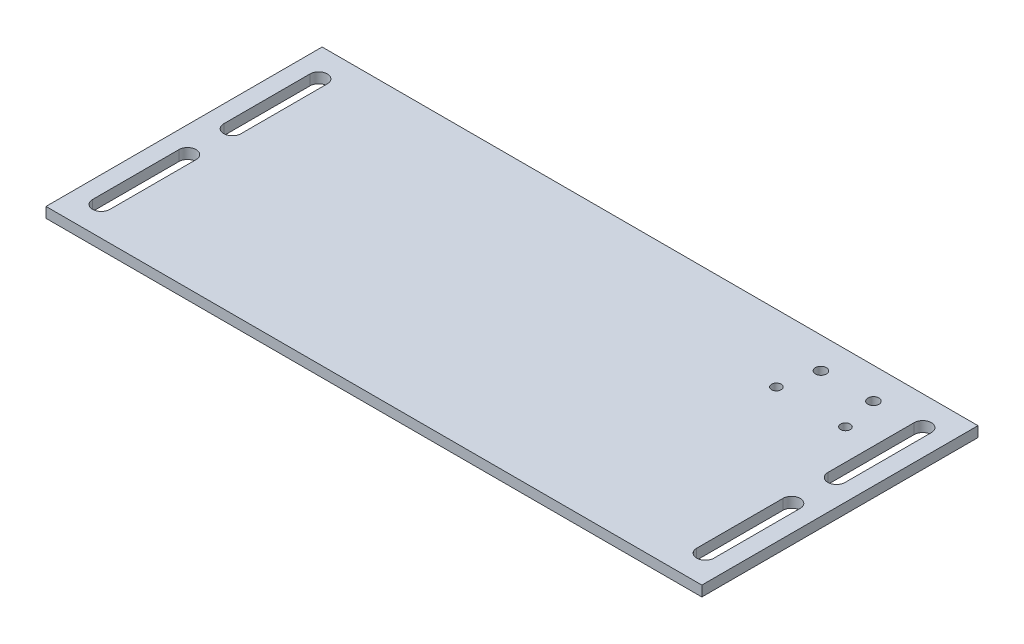
ISO-10303-21;
HEADER;
FILE_DESCRIPTION(('STEP AP214'),'2;1');
FILE_NAME('part.step','',(''),(''),'','','');
FILE_SCHEMA(('AUTOMOTIVE_DESIGN { 1 0 10303 214 1 1 1 1 }'));
ENDSEC;
DATA;
#1=APPLICATION_CONTEXT('core data for automotive mechanical design processes');
#2=APPLICATION_PROTOCOL_DEFINITION('international standard','automotive_design',2000,#1);
#3=PRODUCT_CONTEXT('',#1,'mechanical');
#4=PRODUCT('Part','Part','',(#3));
#5=PRODUCT_RELATED_PRODUCT_CATEGORY('part','',(#4));
#6=PRODUCT_DEFINITION_FORMATION('','',#4);
#7=PRODUCT_DEFINITION_CONTEXT('part definition',#1,'design');
#8=PRODUCT_DEFINITION('design','',#6,#7);
#9=PRODUCT_DEFINITION_SHAPE('','',#8);
#10=(LENGTH_UNIT() NAMED_UNIT(*) SI_UNIT(.MILLI.,.METRE.));
#11=(NAMED_UNIT(*) PLANE_ANGLE_UNIT() SI_UNIT($,.RADIAN.));
#12=(NAMED_UNIT(*) SI_UNIT($,.STERADIAN.) SOLID_ANGLE_UNIT());
#13=UNCERTAINTY_MEASURE_WITH_UNIT(LENGTH_MEASURE(1.E-05),#10,'distance_accuracy_value','');
#14=(GEOMETRIC_REPRESENTATION_CONTEXT(3) GLOBAL_UNCERTAINTY_ASSIGNED_CONTEXT((#13)) GLOBAL_UNIT_ASSIGNED_CONTEXT((#10,
#11,#12)) REPRESENTATION_CONTEXT('',''));
#15=CARTESIAN_POINT('',(0.,0.,0.));
#16=DIRECTION('',(0.,0.,1.));
#17=DIRECTION('',(1.,0.,0.));
#18=AXIS2_PLACEMENT_3D('',#15,#16,#17);
#19=CARTESIAN_POINT('',(0.,3.,0.));
#20=DIRECTION('',(0.,1.,0.));
#21=DIRECTION('',(0.,0.,1.));
#22=AXIS2_PLACEMENT_3D('',#19,#20,#21);
#23=PLANE('',#22);
#24=CARTESIAN_POINT('',(76.1,3.,-20.5));
#25=DIRECTION('',(0.,1.,0.));
#26=DIRECTION('',(0.,0.,1.));
#27=AXIS2_PLACEMENT_3D('',#24,#25,#26);
#28=CIRCLE('',#27,1.4);
#29=CARTESIAN_POINT('',(76.1,3.,-19.1));
#30=VERTEX_POINT('',#29);
#31=EDGE_CURVE('E581',#30,#30,#28,.T.);
#32=ORIENTED_EDGE('',*,*,#31,.F.);
#33=EDGE_LOOP('',(#32));
#34=FACE_BOUND('',#33,.T.);
#35=CARTESIAN_POINT('',(58.495,3.,-31.));
#36=DIRECTION('',(0.,1.,0.));
#37=DIRECTION('',(0.,0.,1.));
#38=AXIS2_PLACEMENT_3D('',#35,#36,#37);
#39=CIRCLE('',#38,1.6);
#40=CARTESIAN_POINT('',(58.495,3.,-29.4));
#41=VERTEX_POINT('',#40);
#42=EDGE_CURVE('E587',#41,#41,#39,.T.);
#43=ORIENTED_EDGE('',*,*,#42,.F.);
#44=EDGE_LOOP('',(#43));
#45=FACE_BOUND('',#44,.T.);
#46=CARTESIAN_POINT('',(73.705,3.,-31.));
#47=DIRECTION('',(0.,1.,0.));
#48=DIRECTION('',(0.,0.,1.));
#49=AXIS2_PLACEMENT_3D('',#46,#47,#48);
#50=CIRCLE('',#49,1.60000000000001);
#51=CARTESIAN_POINT('',(73.705,3.,-29.4));
#52=VERTEX_POINT('',#51);
#53=EDGE_CURVE('E604',#52,#52,#50,.T.);
#54=ORIENTED_EDGE('',*,*,#53,.F.);
#55=EDGE_LOOP('',(#54));
#56=FACE_BOUND('',#55,.T.);
#57=CARTESIAN_POINT('',(56.1,3.,-20.5));
#58=DIRECTION('',(0.,1.,0.));
#59=DIRECTION('',(0.,0.,1.));
#60=AXIS2_PLACEMENT_3D('',#57,#58,#59);
#61=CIRCLE('',#60,1.4);
#62=CARTESIAN_POINT('',(56.1,3.,-19.1));
#63=VERTEX_POINT('',#62);
#64=EDGE_CURVE('E584',#63,#63,#61,.T.);
#65=ORIENTED_EDGE('',*,*,#64,.F.);
#66=EDGE_LOOP('',(#65));
#67=FACE_BOUND('',#66,.T.);
#68=DIRECTION('',(0.,0.,1.));
#69=VECTOR('',#68,1.);
#70=CARTESIAN_POINT('',(-95.,3.,-40.));
#71=LINE('',#70,#69);
#72=CARTESIAN_POINT('',(-95.,3.,-40.));
#73=VERTEX_POINT('',#72);
#74=CARTESIAN_POINT('',(-95.,3.,40.));
#75=VERTEX_POINT('',#74);
#76=EDGE_CURVE('E304',#73,#75,#71,.T.);
#77=ORIENTED_EDGE('',*,*,#76,.T.);
#78=DIRECTION('',(1.,0.,0.));
#79=VECTOR('',#78,1.);
#80=CARTESIAN_POINT('',(-95.,3.,40.));
#81=LINE('',#80,#79);
#82=CARTESIAN_POINT('',(95.,3.,40.));
#83=VERTEX_POINT('',#82);
#84=EDGE_CURVE('E307',#75,#83,#81,.T.);
#85=ORIENTED_EDGE('',*,*,#84,.T.);
#86=DIRECTION('',(0.,0.,-1.));
#87=VECTOR('',#86,1.);
#88=CARTESIAN_POINT('',(95.,3.,-40.));
#89=LINE('',#88,#87);
#90=CARTESIAN_POINT('',(95.,3.,-40.));
#91=VERTEX_POINT('',#90);
#92=EDGE_CURVE('E310',#83,#91,#89,.T.);
#93=ORIENTED_EDGE('',*,*,#92,.T.);
#94=DIRECTION('',(-1.,0.,0.));
#95=VECTOR('',#94,1.);
#96=CARTESIAN_POINT('',(-95.,3.,-40.));
#97=LINE('',#96,#95);
#98=EDGE_CURVE('E312',#91,#73,#97,.T.);
#99=ORIENTED_EDGE('',*,*,#98,.T.);
#100=EDGE_LOOP('',(#77,#85,#93,#99));
#101=FACE_BOUND('',#100,.T.);
#102=DIRECTION('',(0.,0.,-1.));
#103=VECTOR('',#102,1.);
#104=CARTESIAN_POINT('',(-85.,3.,-6.5));
#105=LINE('',#104,#103);
#106=CARTESIAN_POINT('',(-85.,3.,-6.5));
#107=VERTEX_POINT('',#106);
#108=CARTESIAN_POINT('',(-85.,3.,-31.5));
#109=VERTEX_POINT('',#108);
#110=EDGE_CURVE('E275',#107,#109,#105,.T.);
#111=ORIENTED_EDGE('',*,*,#110,.F.);
#112=CARTESIAN_POINT('',(-87.5,3.,-6.5));
#113=DIRECTION('',(0.,1.,0.));
#114=DIRECTION('',(0.,0.,1.));
#115=AXIS2_PLACEMENT_3D('',#112,#113,#114);
#116=CIRCLE('',#115,2.5);
#117=CARTESIAN_POINT('',(-90.,3.,-6.5));
#118=VERTEX_POINT('',#117);
#119=EDGE_CURVE('E273',#118,#107,#116,.T.);
#120=ORIENTED_EDGE('',*,*,#119,.F.);
#121=DIRECTION('',(0.,0.,1.));
#122=VECTOR('',#121,1.);
#123=CARTESIAN_POINT('',(-90.,3.,-6.5));
#124=LINE('',#123,#122);
#125=CARTESIAN_POINT('',(-90.,3.,-31.5));
#126=VERTEX_POINT('',#125);
#127=EDGE_CURVE('E281',#126,#118,#124,.T.);
#128=ORIENTED_EDGE('',*,*,#127,.F.);
#129=CARTESIAN_POINT('',(-87.5,3.,-31.5));
#130=DIRECTION('',(0.,1.,0.));
#131=DIRECTION('',(0.,0.,1.));
#132=AXIS2_PLACEMENT_3D('',#129,#130,#131);
#133=CIRCLE('',#132,2.5);
#134=EDGE_CURVE('E278',#109,#126,#133,.T.);
#135=ORIENTED_EDGE('',*,*,#134,.F.);
#136=EDGE_LOOP('',(#111,#120,#128,#135));
#137=FACE_BOUND('',#136,.T.);
#138=DIRECTION('',(0.,0.,1.));
#139=VECTOR('',#138,1.);
#140=CARTESIAN_POINT('',(-90.,3.,6.49999999999996));
#141=LINE('',#140,#139);
#142=CARTESIAN_POINT('',(-90.,3.,6.49999999999996));
#143=VERTEX_POINT('',#142);
#144=CARTESIAN_POINT('',(-90.,3.,31.5));
#145=VERTEX_POINT('',#144);
#146=EDGE_CURVE('E244',#143,#145,#141,.T.);
#147=ORIENTED_EDGE('',*,*,#146,.F.);
#148=CARTESIAN_POINT('',(-87.5,3.,6.5));
#149=DIRECTION('',(0.,1.,0.));
#150=DIRECTION('',(0.,0.,-1.));
#151=AXIS2_PLACEMENT_3D('',#148,#149,#150);
#152=CIRCLE('',#151,2.5);
#153=CARTESIAN_POINT('',(-85.,3.,6.49999999999996));
#154=VERTEX_POINT('',#153);
#155=EDGE_CURVE('E242',#154,#143,#152,.T.);
#156=ORIENTED_EDGE('',*,*,#155,.F.);
#157=DIRECTION('',(0.,0.,-1.));
#158=VECTOR('',#157,1.);
#159=CARTESIAN_POINT('',(-85.,3.,6.49999999999996));
#160=LINE('',#159,#158);
#161=CARTESIAN_POINT('',(-85.,3.,31.5));
#162=VERTEX_POINT('',#161);
#163=EDGE_CURVE('E250',#162,#154,#160,.T.);
#164=ORIENTED_EDGE('',*,*,#163,.F.);
#165=CARTESIAN_POINT('',(-87.5,3.,31.5));
#166=DIRECTION('',(0.,1.,0.));
#167=DIRECTION('',(0.,0.,-1.));
#168=AXIS2_PLACEMENT_3D('',#165,#166,#167);
#169=CIRCLE('',#168,2.5);
#170=EDGE_CURVE('E247',#145,#162,#169,.T.);
#171=ORIENTED_EDGE('',*,*,#170,.F.);
#172=EDGE_LOOP('',(#147,#156,#164,#171));
#173=FACE_BOUND('',#172,.T.);
#174=DIRECTION('',(0.,0.,-1.));
#175=VECTOR('',#174,1.);
#176=CARTESIAN_POINT('',(90.,3.,-6.5));
#177=LINE('',#176,#175);
#178=CARTESIAN_POINT('',(90.,3.,-6.5));
#179=VERTEX_POINT('',#178);
#180=CARTESIAN_POINT('',(90.,3.,-31.5));
#181=VERTEX_POINT('',#180);
#182=EDGE_CURVE('E213',#179,#181,#177,.T.);
#183=ORIENTED_EDGE('',*,*,#182,.F.);
#184=CARTESIAN_POINT('',(87.5,3.,-6.5));
#185=DIRECTION('',(0.,1.,0.));
#186=DIRECTION('',(0.,0.,-1.));
#187=AXIS2_PLACEMENT_3D('',#184,#185,#186);
#188=CIRCLE('',#187,2.5);
#189=CARTESIAN_POINT('',(85.,3.,-6.5));
#190=VERTEX_POINT('',#189);
#191=EDGE_CURVE('E211',#190,#179,#188,.T.);
#192=ORIENTED_EDGE('',*,*,#191,.F.);
#193=DIRECTION('',(0.,0.,1.));
#194=VECTOR('',#193,1.);
#195=CARTESIAN_POINT('',(85.,3.,-6.5));
#196=LINE('',#195,#194);
#197=CARTESIAN_POINT('',(85.,3.,-31.5));
#198=VERTEX_POINT('',#197);
#199=EDGE_CURVE('E219',#198,#190,#196,.T.);
#200=ORIENTED_EDGE('',*,*,#199,.F.);
#201=CARTESIAN_POINT('',(87.5,3.,-31.5));
#202=DIRECTION('',(0.,1.,0.));
#203=DIRECTION('',(0.,0.,-1.));
#204=AXIS2_PLACEMENT_3D('',#201,#202,#203);
#205=CIRCLE('',#204,2.5);
#206=EDGE_CURVE('E216',#181,#198,#205,.T.);
#207=ORIENTED_EDGE('',*,*,#206,.F.);
#208=EDGE_LOOP('',(#183,#192,#200,#207));
#209=FACE_BOUND('',#208,.T.);
#210=DIRECTION('',(0.,0.,1.));
#211=VECTOR('',#210,1.);
#212=CARTESIAN_POINT('',(85.,3.,6.49999999999996));
#213=LINE('',#212,#211);
#214=CARTESIAN_POINT('',(85.,3.,6.49999999999996));
#215=VERTEX_POINT('',#214);
#216=CARTESIAN_POINT('',(85.,3.,31.5));
#217=VERTEX_POINT('',#216);
#218=EDGE_CURVE('E181',#215,#217,#213,.T.);
#219=ORIENTED_EDGE('',*,*,#218,.F.);
#220=CARTESIAN_POINT('',(87.5,3.,6.49999999999996));
#221=DIRECTION('',(0.,1.,0.));
#222=DIRECTION('',(0.,0.,1.));
#223=AXIS2_PLACEMENT_3D('',#220,#221,#222);
#224=CIRCLE('',#223,2.5);
#225=CARTESIAN_POINT('',(90.,3.,6.49999999999996));
#226=VERTEX_POINT('',#225);
#227=EDGE_CURVE('E173',#226,#215,#224,.T.);
#228=ORIENTED_EDGE('',*,*,#227,.F.);
#229=DIRECTION('',(0.,0.,-1.));
#230=VECTOR('',#229,1.);
#231=CARTESIAN_POINT('',(90.,3.,6.49999999999996));
#232=LINE('',#231,#230);
#233=CARTESIAN_POINT('',(90.,3.,31.5));
#234=VERTEX_POINT('',#233);
#235=EDGE_CURVE('E195',#234,#226,#232,.T.);
#236=ORIENTED_EDGE('',*,*,#235,.F.);
#237=CARTESIAN_POINT('',(87.5,3.,31.5));
#238=DIRECTION('',(0.,1.,0.));
#239=DIRECTION('',(0.,0.,1.));
#240=AXIS2_PLACEMENT_3D('',#237,#238,#239);
#241=CIRCLE('',#240,2.5);
#242=EDGE_CURVE('E193',#217,#234,#241,.T.);
#243=ORIENTED_EDGE('',*,*,#242,.F.);
#244=EDGE_LOOP('',(#219,#228,#236,#243));
#245=FACE_BOUND('',#244,.T.);
#246=ADVANCED_FACE('F36',(#34,#45,#56,#67,#101,#137,#173,#209,#245),#23,.T.);
#247=CARTESIAN_POINT('',(0.,0.,0.));
#248=DIRECTION('',(0.,1.,0.));
#249=DIRECTION('',(0.,0.,1.));
#250=AXIS2_PLACEMENT_3D('',#247,#248,#249);
#251=PLANE('',#250);
#252=CARTESIAN_POINT('',(76.1,0.,-20.5));
#253=DIRECTION('',(0.,1.,0.));
#254=DIRECTION('',(0.,0.,1.));
#255=AXIS2_PLACEMENT_3D('',#252,#253,#254);
#256=CIRCLE('',#255,1.4);
#257=CARTESIAN_POINT('',(76.1,0.,-19.1));
#258=VERTEX_POINT('',#257);
#259=EDGE_CURVE('E579',#258,#258,#256,.T.);
#260=ORIENTED_EDGE('',*,*,#259,.T.);
#261=EDGE_LOOP('',(#260));
#262=FACE_BOUND('',#261,.T.);
#263=CARTESIAN_POINT('',(58.495,0.,-31.));
#264=DIRECTION('',(0.,1.,0.));
#265=DIRECTION('',(0.,0.,1.));
#266=AXIS2_PLACEMENT_3D('',#263,#264,#265);
#267=CIRCLE('',#266,1.6);
#268=CARTESIAN_POINT('',(58.495,0.,-29.4));
#269=VERTEX_POINT('',#268);
#270=EDGE_CURVE('E582',#269,#269,#267,.T.);
#271=ORIENTED_EDGE('',*,*,#270,.T.);
#272=EDGE_LOOP('',(#271));
#273=FACE_BOUND('',#272,.T.);
#274=CARTESIAN_POINT('',(73.705,0.,-31.));
#275=DIRECTION('',(0.,1.,0.));
#276=DIRECTION('',(0.,0.,1.));
#277=AXIS2_PLACEMENT_3D('',#274,#275,#276);
#278=CIRCLE('',#277,1.60000000000001);
#279=CARTESIAN_POINT('',(73.705,0.,-29.4));
#280=VERTEX_POINT('',#279);
#281=EDGE_CURVE('E593',#280,#280,#278,.T.);
#282=ORIENTED_EDGE('',*,*,#281,.T.);
#283=EDGE_LOOP('',(#282));
#284=FACE_BOUND('',#283,.T.);
#285=CARTESIAN_POINT('',(56.1,0.,-20.5));
#286=DIRECTION('',(0.,1.,0.));
#287=DIRECTION('',(0.,0.,1.));
#288=AXIS2_PLACEMENT_3D('',#285,#286,#287);
#289=CIRCLE('',#288,1.4);
#290=CARTESIAN_POINT('',(56.1,0.,-19.1));
#291=VERTEX_POINT('',#290);
#292=EDGE_CURVE('E201',#291,#291,#289,.T.);
#293=ORIENTED_EDGE('',*,*,#292,.T.);
#294=EDGE_LOOP('',(#293));
#295=FACE_BOUND('',#294,.T.);
#296=CARTESIAN_POINT('',(87.5,0.,-6.5));
#297=DIRECTION('',(0.,1.,0.));
#298=DIRECTION('',(0.,0.,-1.));
#299=AXIS2_PLACEMENT_3D('',#296,#297,#298);
#300=CIRCLE('',#299,2.5);
#301=CARTESIAN_POINT('',(85.,0.,-6.5));
#302=VERTEX_POINT('',#301);
#303=CARTESIAN_POINT('',(90.,0.,-6.5));
#304=VERTEX_POINT('',#303);
#305=EDGE_CURVE('E189',#302,#304,#300,.T.);
#306=ORIENTED_EDGE('',*,*,#305,.T.);
#307=DIRECTION('',(0.,0.,-1.));
#308=VECTOR('',#307,1.);
#309=CARTESIAN_POINT('',(90.,0.,-6.5));
#310=LINE('',#309,#308);
#311=CARTESIAN_POINT('',(90.,0.,-31.5));
#312=VERTEX_POINT('',#311);
#313=EDGE_CURVE('E224',#304,#312,#310,.T.);
#314=ORIENTED_EDGE('',*,*,#313,.T.);
#315=CARTESIAN_POINT('',(87.5,0.,-31.5));
#316=DIRECTION('',(0.,1.,0.));
#317=DIRECTION('',(0.,0.,-1.));
#318=AXIS2_PLACEMENT_3D('',#315,#316,#317);
#319=CIRCLE('',#318,2.5);
#320=CARTESIAN_POINT('',(85.,0.,-31.5));
#321=VERTEX_POINT('',#320);
#322=EDGE_CURVE('E227',#312,#321,#319,.T.);
#323=ORIENTED_EDGE('',*,*,#322,.T.);
#324=DIRECTION('',(0.,0.,1.));
#325=VECTOR('',#324,1.);
#326=CARTESIAN_POINT('',(85.,0.,-6.5));
#327=LINE('',#326,#325);
#328=EDGE_CURVE('E214',#321,#302,#327,.T.);
#329=ORIENTED_EDGE('',*,*,#328,.T.);
#330=EDGE_LOOP('',(#306,#314,#323,#329));
#331=FACE_BOUND('',#330,.T.);
#332=CARTESIAN_POINT('',(-87.5,0.,-6.5));
#333=DIRECTION('',(0.,1.,0.));
#334=DIRECTION('',(0.,0.,1.));
#335=AXIS2_PLACEMENT_3D('',#332,#333,#334);
#336=CIRCLE('',#335,2.5);
#337=CARTESIAN_POINT('',(-90.,0.,-6.5));
#338=VERTEX_POINT('',#337);
#339=CARTESIAN_POINT('',(-85.,0.,-6.5));
#340=VERTEX_POINT('',#339);
#341=EDGE_CURVE('E272',#338,#340,#336,.T.);
#342=ORIENTED_EDGE('',*,*,#341,.T.);
#343=DIRECTION('',(0.,0.,-1.));
#344=VECTOR('',#343,1.);
#345=CARTESIAN_POINT('',(-85.,0.,-6.5));
#346=LINE('',#345,#344);
#347=CARTESIAN_POINT('',(-85.,0.,-31.5));
#348=VERTEX_POINT('',#347);
#349=EDGE_CURVE('E286',#340,#348,#346,.T.);
#350=ORIENTED_EDGE('',*,*,#349,.T.);
#351=CARTESIAN_POINT('',(-87.5,0.,-31.5));
#352=DIRECTION('',(0.,1.,0.));
#353=DIRECTION('',(0.,0.,1.));
#354=AXIS2_PLACEMENT_3D('',#351,#352,#353);
#355=CIRCLE('',#354,2.5);
#356=CARTESIAN_POINT('',(-90.,0.,-31.5));
#357=VERTEX_POINT('',#356);
#358=EDGE_CURVE('E289',#348,#357,#355,.T.);
#359=ORIENTED_EDGE('',*,*,#358,.T.);
#360=DIRECTION('',(0.,0.,1.));
#361=VECTOR('',#360,1.);
#362=CARTESIAN_POINT('',(-90.,0.,-6.5));
#363=LINE('',#362,#361);
#364=EDGE_CURVE('E276',#357,#338,#363,.T.);
#365=ORIENTED_EDGE('',*,*,#364,.T.);
#366=EDGE_LOOP('',(#342,#350,#359,#365));
#367=FACE_BOUND('',#366,.T.);
#368=DIRECTION('',(0.,0.,1.));
#369=VECTOR('',#368,1.);
#370=CARTESIAN_POINT('',(-95.,0.,-40.));
#371=LINE('',#370,#369);
#372=CARTESIAN_POINT('',(-95.,0.,-40.));
#373=VERTEX_POINT('',#372);
#374=CARTESIAN_POINT('',(-95.,0.,40.));
#375=VERTEX_POINT('',#374);
#376=EDGE_CURVE('E303',#373,#375,#371,.T.);
#377=ORIENTED_EDGE('',*,*,#376,.F.);
#378=DIRECTION('',(-1.,0.,0.));
#379=VECTOR('',#378,1.);
#380=CARTESIAN_POINT('',(-95.,0.,-40.));
#381=LINE('',#380,#379);
#382=CARTESIAN_POINT('',(95.,0.,-40.));
#383=VERTEX_POINT('',#382);
#384=EDGE_CURVE('E308',#383,#373,#381,.T.);
#385=ORIENTED_EDGE('',*,*,#384,.F.);
#386=DIRECTION('',(0.,0.,-1.));
#387=VECTOR('',#386,1.);
#388=CARTESIAN_POINT('',(95.,0.,-40.));
#389=LINE('',#388,#387);
#390=CARTESIAN_POINT('',(95.,0.,40.));
#391=VERTEX_POINT('',#390);
#392=EDGE_CURVE('E319',#391,#383,#389,.T.);
#393=ORIENTED_EDGE('',*,*,#392,.F.);
#394=DIRECTION('',(1.,0.,0.));
#395=VECTOR('',#394,1.);
#396=CARTESIAN_POINT('',(-95.,0.,40.));
#397=LINE('',#396,#395);
#398=EDGE_CURVE('E317',#375,#391,#397,.T.);
#399=ORIENTED_EDGE('',*,*,#398,.F.);
#400=EDGE_LOOP('',(#377,#385,#393,#399));
#401=FACE_BOUND('',#400,.T.);
#402=CARTESIAN_POINT('',(-87.5,0.,6.5));
#403=DIRECTION('',(0.,1.,0.));
#404=DIRECTION('',(0.,0.,-1.));
#405=AXIS2_PLACEMENT_3D('',#402,#403,#404);
#406=CIRCLE('',#405,2.5);
#407=CARTESIAN_POINT('',(-85.,0.,6.49999999999996));
#408=VERTEX_POINT('',#407);
#409=CARTESIAN_POINT('',(-90.,0.,6.49999999999996));
#410=VERTEX_POINT('',#409);
#411=EDGE_CURVE('E241',#408,#410,#406,.T.);
#412=ORIENTED_EDGE('',*,*,#411,.T.);
#413=DIRECTION('',(0.,0.,1.));
#414=VECTOR('',#413,1.);
#415=CARTESIAN_POINT('',(-90.,0.,6.49999999999996));
#416=LINE('',#415,#414);
#417=CARTESIAN_POINT('',(-90.,0.,31.5));
#418=VERTEX_POINT('',#417);
#419=EDGE_CURVE('E255',#410,#418,#416,.T.);
#420=ORIENTED_EDGE('',*,*,#419,.T.);
#421=CARTESIAN_POINT('',(-87.5,0.,31.5));
#422=DIRECTION('',(0.,1.,0.));
#423=DIRECTION('',(0.,0.,-1.));
#424=AXIS2_PLACEMENT_3D('',#421,#422,#423);
#425=CIRCLE('',#424,2.5);
#426=CARTESIAN_POINT('',(-85.,0.,31.5));
#427=VERTEX_POINT('',#426);
#428=EDGE_CURVE('E258',#418,#427,#425,.T.);
#429=ORIENTED_EDGE('',*,*,#428,.T.);
#430=DIRECTION('',(0.,0.,-1.));
#431=VECTOR('',#430,1.);
#432=CARTESIAN_POINT('',(-85.,0.,6.49999999999996));
#433=LINE('',#432,#431);
#434=EDGE_CURVE('E245',#427,#408,#433,.T.);
#435=ORIENTED_EDGE('',*,*,#434,.T.);
#436=EDGE_LOOP('',(#412,#420,#429,#435));
#437=FACE_BOUND('',#436,.T.);
#438=CARTESIAN_POINT('',(87.5,0.,6.49999999999996));
#439=DIRECTION('',(0.,1.,0.));
#440=DIRECTION('',(0.,0.,1.));
#441=AXIS2_PLACEMENT_3D('',#438,#439,#440);
#442=CIRCLE('',#441,2.5);
#443=CARTESIAN_POINT('',(90.,0.,6.49999999999996));
#444=VERTEX_POINT('',#443);
#445=CARTESIAN_POINT('',(85.,0.,6.49999999999996));
#446=VERTEX_POINT('',#445);
#447=EDGE_CURVE('E59',#444,#446,#442,.T.);
#448=ORIENTED_EDGE('',*,*,#447,.T.);
#449=DIRECTION('',(0.,0.,1.));
#450=VECTOR('',#449,1.);
#451=CARTESIAN_POINT('',(85.,0.,6.49999999999996));
#452=LINE('',#451,#450);
#453=CARTESIAN_POINT('',(85.,0.,31.5));
#454=VERTEX_POINT('',#453);
#455=EDGE_CURVE('E188',#446,#454,#452,.T.);
#456=ORIENTED_EDGE('',*,*,#455,.T.);
#457=CARTESIAN_POINT('',(87.5,0.,31.5));
#458=DIRECTION('',(0.,1.,0.));
#459=DIRECTION('',(0.,0.,1.));
#460=AXIS2_PLACEMENT_3D('',#457,#458,#459);
#461=CIRCLE('',#460,2.5);
#462=CARTESIAN_POINT('',(90.,0.,31.5));
#463=VERTEX_POINT('',#462);
#464=EDGE_CURVE('E203',#454,#463,#461,.T.);
#465=ORIENTED_EDGE('',*,*,#464,.T.);
#466=DIRECTION('',(0.,0.,-1.));
#467=VECTOR('',#466,1.);
#468=CARTESIAN_POINT('',(90.,0.,6.49999999999996));
#469=LINE('',#468,#467);
#470=EDGE_CURVE('E182',#463,#444,#469,.T.);
#471=ORIENTED_EDGE('',*,*,#470,.T.);
#472=EDGE_LOOP('',(#448,#456,#465,#471));
#473=FACE_BOUND('',#472,.T.);
#474=ADVANCED_FACE('F337',(#262,#273,#284,#295,#331,#367,#401,#437,#473),#251,.F.);
#475=CARTESIAN_POINT('',(-95.,3.,-40.));
#476=DIRECTION('',(1.,0.,0.));
#477=DIRECTION('',(0.,0.,-1.));
#478=AXIS2_PLACEMENT_3D('',#475,#476,#477);
#479=PLANE('',#478);
#480=ORIENTED_EDGE('',*,*,#376,.T.);
#481=DIRECTION('',(0.,-1.,0.));
#482=VECTOR('',#481,1.);
#483=CARTESIAN_POINT('',(-95.,3.,40.));
#484=LINE('',#483,#482);
#485=EDGE_CURVE('E11',#75,#375,#484,.T.);
#486=ORIENTED_EDGE('',*,*,#485,.F.);
#487=ORIENTED_EDGE('',*,*,#76,.F.);
#488=DIRECTION('',(0.,-1.,0.));
#489=VECTOR('',#488,1.);
#490=CARTESIAN_POINT('',(-95.,3.,-40.));
#491=LINE('',#490,#489);
#492=EDGE_CURVE('E314',#73,#373,#491,.T.);
#493=ORIENTED_EDGE('',*,*,#492,.T.);
#494=EDGE_LOOP('',(#480,#486,#487,#493));
#495=FACE_BOUND('',#494,.T.);
#496=ADVANCED_FACE('F38',(#495),#479,.F.);
#497=CARTESIAN_POINT('',(-95.,3.,40.));
#498=DIRECTION('',(0.,0.,-1.));
#499=DIRECTION('',(-1.,0.,0.));
#500=AXIS2_PLACEMENT_3D('',#497,#498,#499);
#501=PLANE('',#500);
#502=ORIENTED_EDGE('',*,*,#398,.T.);
#503=DIRECTION('',(0.,-1.,0.));
#504=VECTOR('',#503,1.);
#505=CARTESIAN_POINT('',(95.,3.,40.));
#506=LINE('',#505,#504);
#507=EDGE_CURVE('E44',#83,#391,#506,.T.);
#508=ORIENTED_EDGE('',*,*,#507,.F.);
#509=ORIENTED_EDGE('',*,*,#84,.F.);
#510=ORIENTED_EDGE('',*,*,#485,.T.);
#511=EDGE_LOOP('',(#502,#508,#509,#510));
#512=FACE_BOUND('',#511,.T.);
#513=ADVANCED_FACE('F348',(#512),#501,.F.);
#514=CARTESIAN_POINT('',(95.,3.,-40.));
#515=DIRECTION('',(-1.,0.,0.));
#516=DIRECTION('',(0.,0.,1.));
#517=AXIS2_PLACEMENT_3D('',#514,#515,#516);
#518=PLANE('',#517);
#519=ORIENTED_EDGE('',*,*,#392,.T.);
#520=DIRECTION('',(0.,-1.,0.));
#521=VECTOR('',#520,1.);
#522=CARTESIAN_POINT('',(95.,3.,-40.));
#523=LINE('',#522,#521);
#524=EDGE_CURVE('E324',#91,#383,#523,.T.);
#525=ORIENTED_EDGE('',*,*,#524,.F.);
#526=ORIENTED_EDGE('',*,*,#92,.F.);
#527=ORIENTED_EDGE('',*,*,#507,.T.);
#528=EDGE_LOOP('',(#519,#525,#526,#527));
#529=FACE_BOUND('',#528,.T.);
#530=ADVANCED_FACE('F331',(#529),#518,.F.);
#531=CARTESIAN_POINT('',(-95.,3.,-40.));
#532=DIRECTION('',(0.,0.,1.));
#533=DIRECTION('',(1.,0.,0.));
#534=AXIS2_PLACEMENT_3D('',#531,#532,#533);
#535=PLANE('',#534);
#536=ORIENTED_EDGE('',*,*,#384,.T.);
#537=ORIENTED_EDGE('',*,*,#492,.F.);
#538=ORIENTED_EDGE('',*,*,#98,.F.);
#539=ORIENTED_EDGE('',*,*,#524,.T.);
#540=EDGE_LOOP('',(#536,#537,#538,#539));
#541=FACE_BOUND('',#540,.T.);
#542=ADVANCED_FACE('F341',(#541),#535,.F.);
#543=CARTESIAN_POINT('',(-87.5,3.,-6.5));
#544=DIRECTION('',(0.,-1.,0.));
#545=DIRECTION('',(0.,0.,-1.));
#546=AXIS2_PLACEMENT_3D('',#543,#544,#545);
#547=CYLINDRICAL_SURFACE('',#546,2.5);
#548=ORIENTED_EDGE('',*,*,#341,.F.);
#549=DIRECTION('',(0.,-1.,0.));
#550=VECTOR('',#549,1.);
#551=CARTESIAN_POINT('',(-90.,3.,-6.5));
#552=LINE('',#551,#550);
#553=EDGE_CURVE('E283',#118,#338,#552,.T.);
#554=ORIENTED_EDGE('',*,*,#553,.F.);
#555=ORIENTED_EDGE('',*,*,#119,.T.);
#556=DIRECTION('',(0.,-1.,0.));
#557=VECTOR('',#556,1.);
#558=CARTESIAN_POINT('',(-85.,3.,-6.5));
#559=LINE('',#558,#557);
#560=EDGE_CURVE('E300',#107,#340,#559,.T.);
#561=ORIENTED_EDGE('',*,*,#560,.T.);
#562=EDGE_LOOP('',(#548,#554,#555,#561));
#563=FACE_BOUND('',#562,.T.);
#564=ADVANCED_FACE('F366',(#563),#547,.F.);
#565=CARTESIAN_POINT('',(-85.,3.,-6.5));
#566=DIRECTION('',(-1.,0.,0.));
#567=DIRECTION('',(0.,0.,1.));
#568=AXIS2_PLACEMENT_3D('',#565,#566,#567);
#569=PLANE('',#568);
#570=ORIENTED_EDGE('',*,*,#349,.F.);
#571=ORIENTED_EDGE('',*,*,#560,.F.);
#572=ORIENTED_EDGE('',*,*,#110,.T.);
#573=DIRECTION('',(0.,-1.,0.));
#574=VECTOR('',#573,1.);
#575=CARTESIAN_POINT('',(-85.,3.,-31.5));
#576=LINE('',#575,#574);
#577=EDGE_CURVE('E298',#109,#348,#576,.T.);
#578=ORIENTED_EDGE('',*,*,#577,.T.);
#579=EDGE_LOOP('',(#570,#571,#572,#578));
#580=FACE_BOUND('',#579,.T.);
#581=ADVANCED_FACE('F373',(#580),#569,.T.);
#582=CARTESIAN_POINT('',(-87.5,3.,-31.5));
#583=DIRECTION('',(0.,-1.,0.));
#584=DIRECTION('',(0.,0.,-1.));
#585=AXIS2_PLACEMENT_3D('',#582,#583,#584);
#586=CYLINDRICAL_SURFACE('',#585,2.5);
#587=ORIENTED_EDGE('',*,*,#358,.F.);
#588=ORIENTED_EDGE('',*,*,#577,.F.);
#589=ORIENTED_EDGE('',*,*,#134,.T.);
#590=DIRECTION('',(0.,-1.,0.));
#591=VECTOR('',#590,1.);
#592=CARTESIAN_POINT('',(-90.,3.,-31.5));
#593=LINE('',#592,#591);
#594=EDGE_CURVE('E296',#126,#357,#593,.T.);
#595=ORIENTED_EDGE('',*,*,#594,.T.);
#596=EDGE_LOOP('',(#587,#588,#589,#595));
#597=FACE_BOUND('',#596,.T.);
#598=ADVANCED_FACE('F378',(#597),#586,.F.);
#599=CARTESIAN_POINT('',(-90.,3.,-6.5));
#600=DIRECTION('',(1.,0.,0.));
#601=DIRECTION('',(0.,0.,-1.));
#602=AXIS2_PLACEMENT_3D('',#599,#600,#601);
#603=PLANE('',#602);
#604=ORIENTED_EDGE('',*,*,#364,.F.);
#605=ORIENTED_EDGE('',*,*,#594,.F.);
#606=ORIENTED_EDGE('',*,*,#127,.T.);
#607=ORIENTED_EDGE('',*,*,#553,.T.);
#608=EDGE_LOOP('',(#604,#605,#606,#607));
#609=FACE_BOUND('',#608,.T.);
#610=ADVANCED_FACE('F386',(#609),#603,.T.);
#611=CARTESIAN_POINT('',(-87.5,3.,6.5));
#612=DIRECTION('',(0.,-1.,0.));
#613=DIRECTION('',(0.,0.,-1.));
#614=AXIS2_PLACEMENT_3D('',#611,#612,#613);
#615=CYLINDRICAL_SURFACE('',#614,2.5);
#616=ORIENTED_EDGE('',*,*,#411,.F.);
#617=DIRECTION('',(0.,-1.,0.));
#618=VECTOR('',#617,1.);
#619=CARTESIAN_POINT('',(-85.,3.,6.49999999999996));
#620=LINE('',#619,#618);
#621=EDGE_CURVE('E252',#154,#408,#620,.T.);
#622=ORIENTED_EDGE('',*,*,#621,.F.);
#623=ORIENTED_EDGE('',*,*,#155,.T.);
#624=DIRECTION('',(0.,-1.,0.));
#625=VECTOR('',#624,1.);
#626=CARTESIAN_POINT('',(-90.,3.,6.49999999999996));
#627=LINE('',#626,#625);
#628=EDGE_CURVE('E269',#143,#410,#627,.T.);
#629=ORIENTED_EDGE('',*,*,#628,.T.);
#630=EDGE_LOOP('',(#616,#622,#623,#629));
#631=FACE_BOUND('',#630,.T.);
#632=ADVANCED_FACE('F441',(#631),#615,.F.);
#633=CARTESIAN_POINT('',(-90.,3.,6.49999999999996));
#634=DIRECTION('',(1.,0.,0.));
#635=DIRECTION('',(0.,0.,-1.));
#636=AXIS2_PLACEMENT_3D('',#633,#634,#635);
#637=PLANE('',#636);
#638=ORIENTED_EDGE('',*,*,#419,.F.);
#639=ORIENTED_EDGE('',*,*,#628,.F.);
#640=ORIENTED_EDGE('',*,*,#146,.T.);
#641=DIRECTION('',(0.,-1.,0.));
#642=VECTOR('',#641,1.);
#643=CARTESIAN_POINT('',(-90.,3.,31.5));
#644=LINE('',#643,#642);
#645=EDGE_CURVE('E267',#145,#418,#644,.T.);
#646=ORIENTED_EDGE('',*,*,#645,.T.);
#647=EDGE_LOOP('',(#638,#639,#640,#646));
#648=FACE_BOUND('',#647,.T.);
#649=ADVANCED_FACE('F437',(#648),#637,.T.);
#650=CARTESIAN_POINT('',(-87.5,3.,31.5));
#651=DIRECTION('',(0.,-1.,0.));
#652=DIRECTION('',(0.,0.,-1.));
#653=AXIS2_PLACEMENT_3D('',#650,#651,#652);
#654=CYLINDRICAL_SURFACE('',#653,2.5);
#655=ORIENTED_EDGE('',*,*,#428,.F.);
#656=ORIENTED_EDGE('',*,*,#645,.F.);
#657=ORIENTED_EDGE('',*,*,#170,.T.);
#658=DIRECTION('',(0.,-1.,0.));
#659=VECTOR('',#658,1.);
#660=CARTESIAN_POINT('',(-85.,3.,31.5));
#661=LINE('',#660,#659);
#662=EDGE_CURVE('E265',#162,#427,#661,.T.);
#663=ORIENTED_EDGE('',*,*,#662,.T.);
#664=EDGE_LOOP('',(#655,#656,#657,#663));
#665=FACE_BOUND('',#664,.T.);
#666=ADVANCED_FACE('F433',(#665),#654,.F.);
#667=CARTESIAN_POINT('',(-85.,3.,6.49999999999996));
#668=DIRECTION('',(-1.,0.,0.));
#669=DIRECTION('',(0.,0.,1.));
#670=AXIS2_PLACEMENT_3D('',#667,#668,#669);
#671=PLANE('',#670);
#672=ORIENTED_EDGE('',*,*,#434,.F.);
#673=ORIENTED_EDGE('',*,*,#662,.F.);
#674=ORIENTED_EDGE('',*,*,#163,.T.);
#675=ORIENTED_EDGE('',*,*,#621,.T.);
#676=EDGE_LOOP('',(#672,#673,#674,#675));
#677=FACE_BOUND('',#676,.T.);
#678=ADVANCED_FACE('F430',(#677),#671,.T.);
#679=CARTESIAN_POINT('',(87.5,3.,-6.5));
#680=DIRECTION('',(0.,-1.,0.));
#681=DIRECTION('',(0.,0.,-1.));
#682=AXIS2_PLACEMENT_3D('',#679,#680,#681);
#683=CYLINDRICAL_SURFACE('',#682,2.5);
#684=ORIENTED_EDGE('',*,*,#305,.F.);
#685=DIRECTION('',(0.,-1.,0.));
#686=VECTOR('',#685,1.);
#687=CARTESIAN_POINT('',(85.,3.,-6.5));
#688=LINE('',#687,#686);
#689=EDGE_CURVE('E221',#190,#302,#688,.T.);
#690=ORIENTED_EDGE('',*,*,#689,.F.);
#691=ORIENTED_EDGE('',*,*,#191,.T.);
#692=DIRECTION('',(0.,-1.,0.));
#693=VECTOR('',#692,1.);
#694=CARTESIAN_POINT('',(90.,3.,-6.5));
#695=LINE('',#694,#693);
#696=EDGE_CURVE('E238',#179,#304,#695,.T.);
#697=ORIENTED_EDGE('',*,*,#696,.T.);
#698=EDGE_LOOP('',(#684,#690,#691,#697));
#699=FACE_BOUND('',#698,.T.);
#700=ADVANCED_FACE('F412',(#699),#683,.F.);
#701=CARTESIAN_POINT('',(90.,3.,-6.5));
#702=DIRECTION('',(-1.,0.,0.));
#703=DIRECTION('',(0.,0.,1.));
#704=AXIS2_PLACEMENT_3D('',#701,#702,#703);
#705=PLANE('',#704);
#706=ORIENTED_EDGE('',*,*,#313,.F.);
#707=ORIENTED_EDGE('',*,*,#696,.F.);
#708=ORIENTED_EDGE('',*,*,#182,.T.);
#709=DIRECTION('',(0.,-1.,0.));
#710=VECTOR('',#709,1.);
#711=CARTESIAN_POINT('',(90.,3.,-31.5));
#712=LINE('',#711,#710);
#713=EDGE_CURVE('E236',#181,#312,#712,.T.);
#714=ORIENTED_EDGE('',*,*,#713,.T.);
#715=EDGE_LOOP('',(#706,#707,#708,#714));
#716=FACE_BOUND('',#715,.T.);
#717=ADVANCED_FACE('F405',(#716),#705,.T.);
#718=CARTESIAN_POINT('',(87.5,3.,-31.5));
#719=DIRECTION('',(0.,-1.,0.));
#720=DIRECTION('',(0.,0.,-1.));
#721=AXIS2_PLACEMENT_3D('',#718,#719,#720);
#722=CYLINDRICAL_SURFACE('',#721,2.5);
#723=ORIENTED_EDGE('',*,*,#322,.F.);
#724=ORIENTED_EDGE('',*,*,#713,.F.);
#725=ORIENTED_EDGE('',*,*,#206,.T.);
#726=DIRECTION('',(0.,-1.,0.));
#727=VECTOR('',#726,1.);
#728=CARTESIAN_POINT('',(85.,3.,-31.5));
#729=LINE('',#728,#727);
#730=EDGE_CURVE('E234',#198,#321,#729,.T.);
#731=ORIENTED_EDGE('',*,*,#730,.T.);
#732=EDGE_LOOP('',(#723,#724,#725,#731));
#733=FACE_BOUND('',#732,.T.);
#734=ADVANCED_FACE('F408',(#733),#722,.F.);
#735=CARTESIAN_POINT('',(85.,3.,-6.5));
#736=DIRECTION('',(1.,0.,0.));
#737=DIRECTION('',(0.,0.,-1.));
#738=AXIS2_PLACEMENT_3D('',#735,#736,#737);
#739=PLANE('',#738);
#740=ORIENTED_EDGE('',*,*,#328,.F.);
#741=ORIENTED_EDGE('',*,*,#730,.F.);
#742=ORIENTED_EDGE('',*,*,#199,.T.);
#743=ORIENTED_EDGE('',*,*,#689,.T.);
#744=EDGE_LOOP('',(#740,#741,#742,#743));
#745=FACE_BOUND('',#744,.T.);
#746=ADVANCED_FACE('F415',(#745),#739,.T.);
#747=CARTESIAN_POINT('',(87.5,3.,6.49999999999996));
#748=DIRECTION('',(0.,-1.,0.));
#749=DIRECTION('',(0.,0.,-1.));
#750=AXIS2_PLACEMENT_3D('',#747,#748,#749);
#751=CYLINDRICAL_SURFACE('',#750,2.5);
#752=ORIENTED_EDGE('',*,*,#447,.F.);
#753=DIRECTION('',(0.,-1.,0.));
#754=VECTOR('',#753,1.);
#755=CARTESIAN_POINT('',(90.,3.,6.49999999999996));
#756=LINE('',#755,#754);
#757=EDGE_CURVE('E177',#226,#444,#756,.T.);
#758=ORIENTED_EDGE('',*,*,#757,.F.);
#759=ORIENTED_EDGE('',*,*,#227,.T.);
#760=DIRECTION('',(0.,-1.,0.));
#761=VECTOR('',#760,1.);
#762=CARTESIAN_POINT('',(85.,3.,6.49999999999996));
#763=LINE('',#762,#761);
#764=EDGE_CURVE('E176',#215,#446,#763,.T.);
#765=ORIENTED_EDGE('',*,*,#764,.T.);
#766=EDGE_LOOP('',(#752,#758,#759,#765));
#767=FACE_BOUND('',#766,.T.);
#768=ADVANCED_FACE('F175',(#767),#751,.F.);
#769=CARTESIAN_POINT('',(85.,3.,6.49999999999996));
#770=DIRECTION('',(1.,0.,0.));
#771=DIRECTION('',(0.,0.,-1.));
#772=AXIS2_PLACEMENT_3D('',#769,#770,#771);
#773=PLANE('',#772);
#774=ORIENTED_EDGE('',*,*,#455,.F.);
#775=ORIENTED_EDGE('',*,*,#764,.F.);
#776=ORIENTED_EDGE('',*,*,#218,.T.);
#777=DIRECTION('',(0.,-1.,0.));
#778=VECTOR('',#777,1.);
#779=CARTESIAN_POINT('',(85.,3.,31.5));
#780=LINE('',#779,#778);
#781=EDGE_CURVE('E190',#217,#454,#780,.T.);
#782=ORIENTED_EDGE('',*,*,#781,.T.);
#783=EDGE_LOOP('',(#774,#775,#776,#782));
#784=FACE_BOUND('',#783,.T.);
#785=ADVANCED_FACE('F185',(#784),#773,.T.);
#786=CARTESIAN_POINT('',(87.5,3.,31.5));
#787=DIRECTION('',(0.,-1.,0.));
#788=DIRECTION('',(0.,0.,-1.));
#789=AXIS2_PLACEMENT_3D('',#786,#787,#788);
#790=CYLINDRICAL_SURFACE('',#789,2.5);
#791=ORIENTED_EDGE('',*,*,#464,.F.);
#792=ORIENTED_EDGE('',*,*,#781,.F.);
#793=ORIENTED_EDGE('',*,*,#242,.T.);
#794=DIRECTION('',(0.,-1.,0.));
#795=VECTOR('',#794,1.);
#796=CARTESIAN_POINT('',(90.,3.,31.5));
#797=LINE('',#796,#795);
#798=EDGE_CURVE('E51',#234,#463,#797,.T.);
#799=ORIENTED_EDGE('',*,*,#798,.T.);
#800=EDGE_LOOP('',(#791,#792,#793,#799));
#801=FACE_BOUND('',#800,.T.);
#802=ADVANCED_FACE('F504',(#801),#790,.F.);
#803=CARTESIAN_POINT('',(90.,3.,6.49999999999996));
#804=DIRECTION('',(-1.,0.,0.));
#805=DIRECTION('',(0.,0.,1.));
#806=AXIS2_PLACEMENT_3D('',#803,#804,#805);
#807=PLANE('',#806);
#808=ORIENTED_EDGE('',*,*,#470,.F.);
#809=ORIENTED_EDGE('',*,*,#798,.F.);
#810=ORIENTED_EDGE('',*,*,#235,.T.);
#811=ORIENTED_EDGE('',*,*,#757,.T.);
#812=EDGE_LOOP('',(#808,#809,#810,#811));
#813=FACE_BOUND('',#812,.T.);
#814=ADVANCED_FACE('F512',(#813),#807,.T.);
#815=CARTESIAN_POINT('',(56.1,0.,-20.5));
#816=DIRECTION('',(0.,1.,0.));
#817=DIRECTION('',(0.,0.,1.));
#818=AXIS2_PLACEMENT_3D('',#815,#816,#817);
#819=CYLINDRICAL_SURFACE('',#818,1.4);
#820=ORIENTED_EDGE('',*,*,#292,.F.);
#821=EDGE_LOOP('',(#820));
#822=FACE_BOUND('',#821,.T.);
#823=ORIENTED_EDGE('',*,*,#64,.T.);
#824=EDGE_LOOP('',(#823));
#825=FACE_BOUND('',#824,.T.);
#826=ADVANCED_FACE('F521',(#822,#825),#819,.F.);
#827=CARTESIAN_POINT('',(73.705,0.,-31.));
#828=DIRECTION('',(0.,1.,0.));
#829=DIRECTION('',(0.,0.,1.));
#830=AXIS2_PLACEMENT_3D('',#827,#828,#829);
#831=CYLINDRICAL_SURFACE('',#830,1.60000000000001);
#832=ORIENTED_EDGE('',*,*,#281,.F.);
#833=EDGE_LOOP('',(#832));
#834=FACE_BOUND('',#833,.T.);
#835=ORIENTED_EDGE('',*,*,#53,.T.);
#836=EDGE_LOOP('',(#835));
#837=FACE_BOUND('',#836,.T.);
#838=ADVANCED_FACE('F542',(#834,#837),#831,.F.);
#839=CARTESIAN_POINT('',(58.495,0.,-31.));
#840=DIRECTION('',(0.,1.,0.));
#841=DIRECTION('',(0.,0.,1.));
#842=AXIS2_PLACEMENT_3D('',#839,#840,#841);
#843=CYLINDRICAL_SURFACE('',#842,1.6);
#844=ORIENTED_EDGE('',*,*,#270,.F.);
#845=EDGE_LOOP('',(#844));
#846=FACE_BOUND('',#845,.T.);
#847=ORIENTED_EDGE('',*,*,#42,.T.);
#848=EDGE_LOOP('',(#847));
#849=FACE_BOUND('',#848,.T.);
#850=ADVANCED_FACE('F552',(#846,#849),#843,.F.);
#851=CARTESIAN_POINT('',(76.1,0.,-20.5));
#852=DIRECTION('',(0.,1.,0.));
#853=DIRECTION('',(0.,0.,1.));
#854=AXIS2_PLACEMENT_3D('',#851,#852,#853);
#855=CYLINDRICAL_SURFACE('',#854,1.4);
#856=ORIENTED_EDGE('',*,*,#259,.F.);
#857=EDGE_LOOP('',(#856));
#858=FACE_BOUND('',#857,.T.);
#859=ORIENTED_EDGE('',*,*,#31,.T.);
#860=EDGE_LOOP('',(#859));
#861=FACE_BOUND('',#860,.T.);
#862=ADVANCED_FACE('F562',(#858,#861),#855,.F.);
#863=CLOSED_SHELL('',(#246,#474,#496,#513,#530,#542,#564,#581,#598,#610,#632,#649,#666,#678,
#700,#717,#734,#746,#768,#785,#802,#814,#826,#838,#850,#862));
#864=MANIFOLD_SOLID_BREP('B2',#863);
#865=ADVANCED_BREP_SHAPE_REPRESENTATION('',(#18,#864),#14);
#866=SHAPE_DEFINITION_REPRESENTATION(#9,#865);
ENDSEC;
END-ISO-10303-21;
